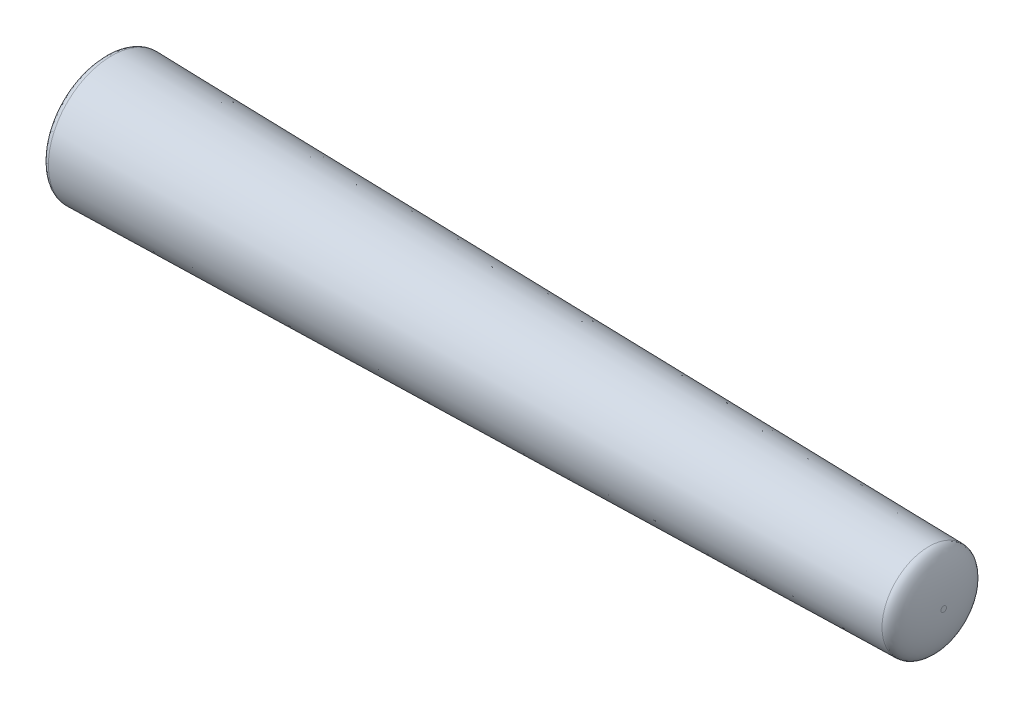
ISO-10303-21;
HEADER;
FILE_DESCRIPTION(('STEP AP214'),'2;1');
FILE_NAME('part.step','',(''),(''),'','','');
FILE_SCHEMA(('AUTOMOTIVE_DESIGN { 1 0 10303 214 1 1 1 1 }'));
ENDSEC;
DATA;
#1=APPLICATION_CONTEXT('core data for automotive mechanical design processes');
#2=APPLICATION_PROTOCOL_DEFINITION('international standard','automotive_design',2000,#1);
#3=PRODUCT_CONTEXT('',#1,'mechanical');
#4=PRODUCT('Part','Part','',(#3));
#5=PRODUCT_RELATED_PRODUCT_CATEGORY('part','',(#4));
#6=PRODUCT_DEFINITION_FORMATION('','',#4);
#7=PRODUCT_DEFINITION_CONTEXT('part definition',#1,'design');
#8=PRODUCT_DEFINITION('design','',#6,#7);
#9=PRODUCT_DEFINITION_SHAPE('','',#8);
#10=(LENGTH_UNIT() NAMED_UNIT(*) SI_UNIT(.MILLI.,.METRE.));
#11=(NAMED_UNIT(*) PLANE_ANGLE_UNIT() SI_UNIT($,.RADIAN.));
#12=(NAMED_UNIT(*) SI_UNIT($,.STERADIAN.) SOLID_ANGLE_UNIT());
#13=UNCERTAINTY_MEASURE_WITH_UNIT(LENGTH_MEASURE(1.E-05),#10,'distance_accuracy_value','');
#14=(GEOMETRIC_REPRESENTATION_CONTEXT(3) GLOBAL_UNCERTAINTY_ASSIGNED_CONTEXT((#13)) GLOBAL_UNIT_ASSIGNED_CONTEXT((#10,
#11,#12)) REPRESENTATION_CONTEXT('',''));
#15=CARTESIAN_POINT('',(0.,0.,0.));
#16=DIRECTION('',(0.,0.,1.));
#17=DIRECTION('',(1.,0.,0.));
#18=AXIS2_PLACEMENT_3D('',#15,#16,#17);
#19=CARTESIAN_POINT('',(0.,0.,0.));
#20=DIRECTION('',(-1.,0.,0.));
#21=DIRECTION('',(0.,0.,-1.));
#22=AXIS2_PLACEMENT_3D('',#19,#20,#21);
#23=CONICAL_SURFACE('',#22,3.5,0.0200712863979348);
#24=CARTESIAN_POINT('',(26.056195828594,0.,-2.97694839094373));
#25=CARTESIAN_POINT('',(26.056195828594,0.389679572021382,-2.97694839094373));
#26=CARTESIAN_POINT('',(26.056195828594,0.779211847391769,-2.89946560387902));
#27=CARTESIAN_POINT('',(26.056195828594,1.49924580904839,-2.60121777159162));
#28=CARTESIAN_POINT('',(26.056195828594,1.82947532661251,-2.38056546234488));
#29=CARTESIAN_POINT('',(26.056195828594,2.38056546234488,-1.82947532661251));
#30=CARTESIAN_POINT('',(26.056195828594,2.60121777159162,-1.49924580904838));
#31=CARTESIAN_POINT('',(26.056195828594,2.89946560387902,-0.779211847391769));
#32=CARTESIAN_POINT('',(26.056195828594,2.97694839094373,-0.389679572021377));
#33=CARTESIAN_POINT('',(26.056195828594,2.97694839094373,0.389679572021376));
#34=CARTESIAN_POINT('',(26.056195828594,2.89946560387902,0.779211847391772));
#35=CARTESIAN_POINT('',(26.056195828594,2.60121777159162,1.49924580904839));
#36=CARTESIAN_POINT('',(26.056195828594,2.38056546234487,1.82947532661251));
#37=CARTESIAN_POINT('',(26.056195828594,1.82947532661251,2.38056546234488));
#38=CARTESIAN_POINT('',(26.056195828594,1.49924580904839,2.60121777159162));
#39=CARTESIAN_POINT('',(26.056195828594,0.779211847391772,2.89946560387902));
#40=CARTESIAN_POINT('',(26.056195828594,0.389679572021377,2.97694839094373));
#41=CARTESIAN_POINT('',(26.056195828594,-0.389679572021376,2.97694839094373));
#42=CARTESIAN_POINT('',(26.056195828594,-0.779211847391766,2.89946560387902));
#43=CARTESIAN_POINT('',(26.056195828594,-1.49924580904838,2.60121777159162));
#44=CARTESIAN_POINT('',(26.056195828594,-1.82947532661251,2.38056546234488));
#45=CARTESIAN_POINT('',(26.056195828594,-2.38056546234488,1.82947532661251));
#46=CARTESIAN_POINT('',(26.056195828594,-2.60121777159162,1.49924580904839));
#47=CARTESIAN_POINT('',(26.056195828594,-2.89946560387902,0.779211847391772));
#48=CARTESIAN_POINT('',(26.056195828594,-2.97694839094373,0.389679572021372));
#49=CARTESIAN_POINT('',(26.056195828594,-2.97694839094373,-0.389679572021382));
#50=CARTESIAN_POINT('',(26.056195828594,-2.89946560387902,-0.779211847391766));
#51=CARTESIAN_POINT('',(26.056195828594,-2.60121777159162,-1.49924580904838));
#52=CARTESIAN_POINT('',(26.056195828594,-2.38056546234488,-1.8294753266125));
#53=CARTESIAN_POINT('',(26.056195828594,-1.82947532661252,-2.38056546234487));
#54=CARTESIAN_POINT('',(26.056195828594,-1.49924580904839,-2.60121777159162));
#55=CARTESIAN_POINT('',(26.056195828594,-0.779211847391773,-2.89946560387902));
#56=CARTESIAN_POINT('',(26.056195828594,-0.389679572021382,-2.97694839094373));
#57=CARTESIAN_POINT('',(26.056195828594,0.,-2.97694839094373));
#58=(BOUNDED_CURVE() B_SPLINE_CURVE(3,(#24,#25,#26,#27,#28,#29,#30,#31,#32,#33,#34,#35,#36,#37,
#38,#39,#40,#41,#42,#43,#44,#45,#46,#47,#48,#49,#50,#51,#52,#53,#54,#55,#56,#57),.UNSPECIFIED.,
.T.,.F.) B_SPLINE_CURVE_WITH_KNOTS((4,2,2,2,2,2,2,2,2,2,2,2,2,2,2,2,4),(0.,0.392699081698724,
0.785398163397448,1.17809724509617,1.5707963267949,1.96349540849362,2.35619449019234,
2.74889357189107,3.14159265358979,3.53429173528852,3.92699081698724,4.31968989868597,
4.71238898038469,5.10508806208341,5.49778714378214,5.89048622548086,6.28318530717959),
.UNSPECIFIED.) CURVE() GEOMETRIC_REPRESENTATION_ITEM() RATIONAL_B_SPLINE_CURVE((0.999999999999998,
0.999999999999998,0.999999999999998,0.999999999999998,0.999999999999998,0.999999999999998,
0.999999999999998,0.999999999999998,0.999999999999998,0.999999999999998,0.999999999999998,
0.999999999999998,0.999999999999998,0.999999999999998,0.999999999999998,0.999999999999998,
0.999999999999998,0.999999999999998,0.999999999999998,0.999999999999998,0.999999999999998,
0.999999999999998,0.999999999999998,0.999999999999998,0.999999999999998,0.999999999999998,
0.999999999999998,0.999999999999998,0.999999999999998,0.999999999999998,0.999999999999998,
0.999999999999998,0.999999999999998,0.999999999999998)) REPRESENTATION_ITEM(''));
#59=CARTESIAN_POINT('',(26.056195828594,0.,-2.97694839094373));
#60=VERTEX_POINT('',#59);
#61=EDGE_CURVE('E11',#60,#60,#58,.F.);
#62=ORIENTED_EDGE('',*,*,#61,.T.);
#63=EDGE_LOOP('',(#62));
#64=FACE_BOUND('',#63,.T.);
#65=CARTESIAN_POINT('',(-25.9257412265007,0.,-4.02043286570699));
#66=CARTESIAN_POINT('',(-25.9257412265007,-0.526272581172899,-4.02043286570699));
#67=CARTESIAN_POINT('',(-25.9257412265007,-1.05234058237466,-3.91579143418526));
#68=CARTESIAN_POINT('',(-25.9257412265007,-2.02476551490968,-3.51299983873951));
#69=CARTESIAN_POINT('',(-25.9257412265007,-2.47074443174679,-3.21500625354656));
#70=CARTESIAN_POINT('',(-25.9257412265007,-3.21500625354658,-2.47074443174677));
#71=CARTESIAN_POINT('',(-25.9257412265007,-3.51299983873951,-2.02476551490967));
#72=CARTESIAN_POINT('',(-25.9257412265007,-3.91579143418526,-1.05234058237464));
#73=CARTESIAN_POINT('',(-25.9257412265007,-4.02043286570699,-0.526272581172893));
#74=CARTESIAN_POINT('',(-25.9257412265007,-4.02043286570699,0.52627258117288));
#75=CARTESIAN_POINT('',(-25.9257412265007,-3.91579143418526,1.05234058237465));
#76=CARTESIAN_POINT('',(-25.9257412265007,-3.51299983873951,2.02476551490968));
#77=CARTESIAN_POINT('',(-25.9257412265007,-3.21500625354658,2.47074443174677));
#78=CARTESIAN_POINT('',(-25.9257412265007,-2.47074443174678,3.21500625354657));
#79=CARTESIAN_POINT('',(-25.9257412265007,-2.02476551490968,3.51299983873951));
#80=CARTESIAN_POINT('',(-25.9257412265007,-1.05234058237464,3.91579143418526));
#81=CARTESIAN_POINT('',(-25.9257412265007,-0.526272581172885,4.02043286570699));
#82=CARTESIAN_POINT('',(-25.9257412265007,0.526272581172886,4.02043286570699));
#83=CARTESIAN_POINT('',(-25.9257412265007,1.05234058237466,3.91579143418526));
#84=CARTESIAN_POINT('',(-25.9257412265007,2.02476551490968,3.51299983873951));
#85=CARTESIAN_POINT('',(-25.9257412265007,2.47074443174678,3.21500625354657));
#86=CARTESIAN_POINT('',(-25.9257412265007,3.21500625354657,2.47074443174678));
#87=CARTESIAN_POINT('',(-25.9257412265007,3.51299983873951,2.02476551490968));
#88=CARTESIAN_POINT('',(-25.9257412265007,3.91579143418526,1.05234058237465));
#89=CARTESIAN_POINT('',(-25.9257412265007,4.02043286570699,0.526272581172885));
#90=CARTESIAN_POINT('',(-25.9257412265007,4.02043286570699,-0.526272581172886));
#91=CARTESIAN_POINT('',(-25.9257412265007,3.91579143418526,-1.05234058237465));
#92=CARTESIAN_POINT('',(-25.9257412265007,3.51299983873951,-2.02476551490968));
#93=CARTESIAN_POINT('',(-25.9257412265007,3.21500625354656,-2.47074443174679));
#94=CARTESIAN_POINT('',(-25.9257412265007,2.47074443174679,-3.21500625354656));
#95=CARTESIAN_POINT('',(-25.9257412265007,2.02476551490968,-3.51299983873951));
#96=CARTESIAN_POINT('',(-25.9257412265007,1.05234058237465,-3.91579143418526));
#97=CARTESIAN_POINT('',(-25.9257412265007,0.526272581172898,-4.02043286570699));
#98=CARTESIAN_POINT('',(-25.9257412265007,0.,-4.02043286570699));
#99=(BOUNDED_CURVE() B_SPLINE_CURVE(3,(#65,#66,#67,#68,#69,#70,#71,#72,#73,#74,#75,#76,#77,#78,
#79,#80,#81,#82,#83,#84,#85,#86,#87,#88,#89,#90,#91,#92,#93,#94,#95,#96,#97,#98),.UNSPECIFIED.,
.T.,.F.) B_SPLINE_CURVE_WITH_KNOTS((4,2,2,2,2,2,2,2,2,2,2,2,2,2,2,2,4),(0.,0.392699081698725,
0.785398163397448,1.17809724509617,1.5707963267949,1.96349540849362,2.35619449019234,
2.74889357189107,3.14159265358979,3.53429173528852,3.92699081698724,4.31968989868597,
4.71238898038469,5.10508806208341,5.49778714378214,5.89048622548086,6.28318530717959),
.UNSPECIFIED.) CURVE() GEOMETRIC_REPRESENTATION_ITEM() RATIONAL_B_SPLINE_CURVE((1.,1.,1.,1.,1.,
1.,1.,1.,1.,1.,1.,1.,1.,1.,1.,1.,1.,1.,1.,1.,1.,1.,1.,1.,1.,1.,1.,1.,1.,1.,1.,1.,1.,1.)) REPRESENTATION_ITEM(''));
#100=CARTESIAN_POINT('',(-25.9257412265007,0.,-4.02043286570699));
#101=VERTEX_POINT('',#100);
#102=EDGE_CURVE('E59',#101,#101,#99,.F.);
#103=ORIENTED_EDGE('',*,*,#102,.T.);
#104=EDGE_LOOP('',(#103));
#105=FACE_BOUND('',#104,.T.);
#106=ADVANCED_FACE('F36',(#64,#105),#23,.T.);
#107=CARTESIAN_POINT('',(-27.,0.,0.));
#108=DIRECTION('',(1.,0.,0.));
#109=DIRECTION('',(0.,0.,-1.));
#110=AXIS2_PLACEMENT_3D('',#107,#108,#109);
#111=PLANE('',#110);
#112=CARTESIAN_POINT('',(-27.,0.,-0.321178125281778));
#113=CARTESIAN_POINT('',(-27.,0.0420420503598163,-0.321178125281778));
#114=CARTESIAN_POINT('',(-27.,0.0840677575511737,-0.31281869237354));
#115=CARTESIAN_POINT('',(-27.,0.161751337215658,-0.280641100102821));
#116=CARTESIAN_POINT('',(-27.,0.197379011451117,-0.256835449259939));
#117=CARTESIAN_POINT('',(-27.,0.256835449259939,-0.197379011451117));
#118=CARTESIAN_POINT('',(-27.,0.280641100102821,-0.161751337215658));
#119=CARTESIAN_POINT('',(-27.,0.31281869237354,-0.084067757551173));
#120=CARTESIAN_POINT('',(-27.,0.321178125281778,-0.0420420503598153));
#121=CARTESIAN_POINT('',(-27.,0.321178125281778,0.0420420503598153));
#122=CARTESIAN_POINT('',(-27.,0.312818692373541,0.0840677575511741));
#123=CARTESIAN_POINT('',(-27.,0.28064110010282,0.161751337215657));
#124=CARTESIAN_POINT('',(-27.,0.25683544925994,0.197379011451117));
#125=CARTESIAN_POINT('',(-27.,0.197379011451115,0.256835449259939));
#126=CARTESIAN_POINT('',(-27.,0.161751337215658,0.28064110010282));
#127=CARTESIAN_POINT('',(-27.,0.0840677575511744,0.312818692373541));
#128=CARTESIAN_POINT('',(-27.,0.0420420503598153,0.321178125281778));
#129=CARTESIAN_POINT('',(-27.,-0.0420420503598153,0.321178125281778));
#130=CARTESIAN_POINT('',(-27.,-0.0840677575511727,0.312818692373541));
#131=CARTESIAN_POINT('',(-27.,-0.161751337215658,0.28064110010282));
#132=CARTESIAN_POINT('',(-27.,-0.197379011451116,0.25683544925994));
#133=CARTESIAN_POINT('',(-27.,-0.256835449259939,0.197379011451115));
#134=CARTESIAN_POINT('',(-27.,-0.28064110010282,0.161751337215658));
#135=CARTESIAN_POINT('',(-27.,-0.312818692373541,0.0840677575511741));
#136=CARTESIAN_POINT('',(-27.,-0.321178125281778,0.0420420503598148));
#137=CARTESIAN_POINT('',(-27.,-0.321178125281778,-0.0420420503598158));
#138=CARTESIAN_POINT('',(-27.,-0.312818692373541,-0.0840677575511729));
#139=CARTESIAN_POINT('',(-27.,-0.28064110010282,-0.161751337215657));
#140=CARTESIAN_POINT('',(-27.,-0.25683544925994,-0.197379011451116));
#141=CARTESIAN_POINT('',(-27.,-0.197379011451117,-0.256835449259939));
#142=CARTESIAN_POINT('',(-27.,-0.161751337215658,-0.28064110010282));
#143=CARTESIAN_POINT('',(-27.,-0.0840677575511738,-0.312818692373541));
#144=CARTESIAN_POINT('',(-27.,-0.0420420503598164,-0.321178125281778));
#145=CARTESIAN_POINT('',(-27.,0.,-0.321178125281778));
#146=(BOUNDED_CURVE() B_SPLINE_CURVE(3,(#112,#113,#114,#115,#116,#117,#118,#119,#120,#121,#122,
#123,#124,#125,#126,#127,#128,#129,#130,#131,#132,#133,#134,#135,#136,#137,#138,#139,#140,#141,
#142,#143,#144,#145),.UNSPECIFIED.,.T.,.F.) B_SPLINE_CURVE_WITH_KNOTS((4,2,2,2,2,2,2,2,2,2,2,2,
2,2,2,2,4),(0.,0.392699081698724,0.785398163397448,1.17809724509617,1.5707963267949,
1.96349540849362,2.35619449019234,2.74889357189107,3.14159265358979,3.53429173528852,
3.92699081698724,4.31968989868597,4.71238898038469,5.10508806208341,5.49778714378214,
5.89048622548086,6.28318530717959),
.UNSPECIFIED.) CURVE() GEOMETRIC_REPRESENTATION_ITEM() RATIONAL_B_SPLINE_CURVE((1.,1.,1.,1.,1.,
1.,1.,1.,1.,1.,1.,1.,1.,1.,1.,1.,1.,1.,1.,1.,1.,1.,1.,1.,1.,1.,1.,1.,1.,1.,1.,1.,1.,1.)) REPRESENTATION_ITEM(''));
#147=CARTESIAN_POINT('',(-27.,0.,-0.321178125281778));
#148=VERTEX_POINT('',#147);
#149=EDGE_CURVE('E54',#148,#148,#146,.F.);
#150=ORIENTED_EDGE('',*,*,#149,.T.);
#151=EDGE_LOOP('',(#150));
#152=FACE_BOUND('',#151,.T.);
#153=ADVANCED_FACE('F82',(#152),#111,.F.);
#154=CARTESIAN_POINT('',(27.,0.,0.));
#155=DIRECTION('',(1.,0.,0.));
#156=DIRECTION('',(0.,0.,-1.));
#157=AXIS2_PLACEMENT_3D('',#154,#155,#156);
#158=PLANE('',#157);
#159=CARTESIAN_POINT('',(27.,0.,-0.177512371162491));
#160=CARTESIAN_POINT('',(27.,-0.0232361921468083,-0.177512371162491));
#161=CARTESIAN_POINT('',(27.,-0.0464636011457927,-0.172892152250407));
#162=CARTESIAN_POINT('',(27.,-0.0893984858216635,-0.155107940718737));
#163=CARTESIAN_POINT('',(27.,-0.10908973235754,-0.141950670429462));
#164=CARTESIAN_POINT('',(27.,-0.141950670429463,-0.109089732357539));
#165=CARTESIAN_POINT('',(27.,-0.155107940718737,-0.089398485821663));
#166=CARTESIAN_POINT('',(27.,-0.172892152250408,-0.0464636011457922));
#167=CARTESIAN_POINT('',(27.,-0.177512371162491,-0.0232361921468083));
#168=CARTESIAN_POINT('',(27.,-0.177512371162491,0.0232361921468077));
#169=CARTESIAN_POINT('',(27.,-0.172892152250407,0.0464636011457927));
#170=CARTESIAN_POINT('',(27.,-0.155107940718737,0.0893984858216635));
#171=CARTESIAN_POINT('',(27.,-0.141950670429462,0.109089732357539));
#172=CARTESIAN_POINT('',(27.,-0.109089732357539,0.141950670429462));
#173=CARTESIAN_POINT('',(27.,-0.089398485821663,0.155107940718737));
#174=CARTESIAN_POINT('',(27.,-0.0464636011457923,0.172892152250408));
#175=CARTESIAN_POINT('',(27.,-0.0232361921468079,0.177512371162491));
#176=CARTESIAN_POINT('',(27.,0.023236192146808,0.177512371162491));
#177=CARTESIAN_POINT('',(27.,0.0464636011457929,0.172892152250408));
#178=CARTESIAN_POINT('',(27.,0.0893984858216633,0.155107940718737));
#179=CARTESIAN_POINT('',(27.,0.109089732357539,0.141950670429462));
#180=CARTESIAN_POINT('',(27.,0.141950670429462,0.10908973235754));
#181=CARTESIAN_POINT('',(27.,0.155107940718737,0.0893984858216633));
#182=CARTESIAN_POINT('',(27.,0.172892152250408,0.0464636011457926));
#183=CARTESIAN_POINT('',(27.,0.177512371162491,0.0232361921468079));
#184=CARTESIAN_POINT('',(27.,0.177512371162491,-0.023236192146808));
#185=CARTESIAN_POINT('',(27.,0.172892152250408,-0.0464636011457924));
#186=CARTESIAN_POINT('',(27.,0.155107940718737,-0.0893984858216632));
#187=CARTESIAN_POINT('',(27.,0.141950670429462,-0.109089732357539));
#188=CARTESIAN_POINT('',(27.,0.109089732357539,-0.141950670429462));
#189=CARTESIAN_POINT('',(27.,0.0893984858216631,-0.155107940718737));
#190=CARTESIAN_POINT('',(27.,0.0464636011457926,-0.172892152250408));
#191=CARTESIAN_POINT('',(27.,0.0232361921468083,-0.177512371162491));
#192=CARTESIAN_POINT('',(27.,0.,-0.177512371162491));
#193=(BOUNDED_CURVE() B_SPLINE_CURVE(3,(#159,#160,#161,#162,#163,#164,#165,#166,#167,#168,#169,
#170,#171,#172,#173,#174,#175,#176,#177,#178,#179,#180,#181,#182,#183,#184,#185,#186,#187,#188,
#189,#190,#191,#192),.UNSPECIFIED.,.T.,.F.) B_SPLINE_CURVE_WITH_KNOTS((4,2,2,2,2,2,2,2,2,2,2,2,
2,2,2,2,4),(0.,0.392699081698725,0.785398163397448,1.17809724509617,1.5707963267949,
1.96349540849362,2.35619449019234,2.74889357189107,3.14159265358979,3.53429173528852,
3.92699081698724,4.31968989868597,4.71238898038469,5.10508806208341,5.49778714378214,
5.89048622548086,6.28318530717959),
.UNSPECIFIED.) CURVE() GEOMETRIC_REPRESENTATION_ITEM() RATIONAL_B_SPLINE_CURVE((1.,1.,1.,1.,1.,
1.,1.,1.,1.,1.,1.,1.,1.,1.,1.,1.,1.,1.,1.,1.,1.,1.,1.,1.,1.,1.,1.,1.,1.,1.,1.,1.,1.,1.)) REPRESENTATION_ITEM(''));
#194=CARTESIAN_POINT('',(27.,0.,-0.177512371162491));
#195=VERTEX_POINT('',#194);
#196=EDGE_CURVE('E49',#195,#195,#193,.F.);
#197=ORIENTED_EDGE('',*,*,#196,.T.);
#198=EDGE_LOOP('',(#197));
#199=FACE_BOUND('',#198,.T.);
#200=ADVANCED_FACE('F115',(#199),#158,.T.);
#201=CARTESIAN_POINT('',(-25.9257412265007,0.,-4.02043286570699));
#202=CARTESIAN_POINT('',(-25.9257412265007,0.526272581172898,-4.02043286570699));
#203=CARTESIAN_POINT('',(-25.9257412265007,1.05234058237465,-3.91579143418526));
#204=CARTESIAN_POINT('',(-25.9257412265007,2.02476551490968,-3.51299983873951));
#205=CARTESIAN_POINT('',(-25.9257412265007,2.47074443174679,-3.21500625354656));
#206=CARTESIAN_POINT('',(-25.9257412265007,3.21500625354656,-2.47074443174679));
#207=CARTESIAN_POINT('',(-25.9257412265007,3.51299983873951,-2.02476551490968));
#208=CARTESIAN_POINT('',(-25.9257412265007,3.91579143418526,-1.05234058237465));
#209=CARTESIAN_POINT('',(-25.9257412265007,4.02043286570699,-0.526272581172886));
#210=CARTESIAN_POINT('',(-25.9257412265007,4.02043286570699,0.526272581172885));
#211=CARTESIAN_POINT('',(-25.9257412265007,3.91579143418526,1.05234058237465));
#212=CARTESIAN_POINT('',(-25.9257412265007,3.51299983873951,2.02476551490968));
#213=CARTESIAN_POINT('',(-25.9257412265007,3.21500625354657,2.47074443174678));
#214=CARTESIAN_POINT('',(-25.9257412265007,2.47074443174678,3.21500625354657));
#215=CARTESIAN_POINT('',(-25.9257412265007,2.02476551490968,3.51299983873951));
#216=CARTESIAN_POINT('',(-25.9257412265007,1.05234058237466,3.91579143418526));
#217=CARTESIAN_POINT('',(-25.9257412265007,0.526272581172886,4.02043286570699));
#218=CARTESIAN_POINT('',(-25.9257412265007,-0.526272581172885,4.02043286570699));
#219=CARTESIAN_POINT('',(-25.9257412265007,-1.05234058237464,3.91579143418526));
#220=CARTESIAN_POINT('',(-25.9257412265007,-2.02476551490968,3.51299983873951));
#221=CARTESIAN_POINT('',(-25.9257412265007,-2.47074443174678,3.21500625354657));
#222=CARTESIAN_POINT('',(-25.9257412265007,-3.21500625354658,2.47074443174677));
#223=CARTESIAN_POINT('',(-25.9257412265007,-3.51299983873951,2.02476551490968));
#224=CARTESIAN_POINT('',(-25.9257412265007,-3.91579143418526,1.05234058237465));
#225=CARTESIAN_POINT('',(-25.9257412265007,-4.02043286570699,0.52627258117288));
#226=CARTESIAN_POINT('',(-25.9257412265007,-4.02043286570699,-0.526272581172893));
#227=CARTESIAN_POINT('',(-25.9257412265007,-3.91579143418526,-1.05234058237464));
#228=CARTESIAN_POINT('',(-25.9257412265007,-3.51299983873951,-2.02476551490967));
#229=CARTESIAN_POINT('',(-25.9257412265007,-3.21500625354658,-2.47074443174677));
#230=CARTESIAN_POINT('',(-25.9257412265007,-2.47074443174679,-3.21500625354656));
#231=CARTESIAN_POINT('',(-25.9257412265007,-2.02476551490968,-3.51299983873951));
#232=CARTESIAN_POINT('',(-25.9257412265007,-1.05234058237466,-3.91579143418526));
#233=CARTESIAN_POINT('',(-25.9257412265007,-0.526272581172899,-4.02043286570699));
#234=CARTESIAN_POINT('',(-25.9257412265007,0.,-4.02043286570699));
#235=CARTESIAN_POINT('',(-27.,0.,-4.04199751711343));
#236=CARTESIAN_POINT('',(-27.,0.529095382880288,-4.04199751711345));
#237=CARTESIAN_POINT('',(-27.,1.05798508847083,-3.93679481369169));
#238=CARTESIAN_POINT('',(-27.,2.03562587844944,-3.53184273935339));
#239=CARTESIAN_POINT('',(-27.,2.48399692076097,-3.23225078701922));
#240=CARTESIAN_POINT('',(-27.,3.23225078701922,-2.48399692076097));
#241=CARTESIAN_POINT('',(-27.,3.53184273935337,-2.03562587844944));
#242=CARTESIAN_POINT('',(-27.,3.9367948136917,-1.05798508847083));
#243=CARTESIAN_POINT('',(-27.,4.04199751711343,-0.529095382880275));
#244=CARTESIAN_POINT('',(-27.,4.04199751711343,0.529095382880274));
#245=CARTESIAN_POINT('',(-27.,3.93679481369168,1.05798508847083));
#246=CARTESIAN_POINT('',(-27.,3.53184273935339,2.03562587844944));
#247=CARTESIAN_POINT('',(-27.,3.23225078701924,2.48399692076098));
#248=CARTESIAN_POINT('',(-27.,2.48399692076094,3.23225078701921));
#249=CARTESIAN_POINT('',(-27.,2.03562587844944,3.53184273935338));
#250=CARTESIAN_POINT('',(-27.,1.05798508847085,3.93679481369169));
#251=CARTESIAN_POINT('',(-27.,0.529095382880275,4.04199751711343));
#252=CARTESIAN_POINT('',(-27.,-0.529095382880274,4.04199751711343));
#253=CARTESIAN_POINT('',(-27.,-1.05798508847082,3.9367948136917));
#254=CARTESIAN_POINT('',(-27.,-2.03562587844944,3.53184273935337));
#255=CARTESIAN_POINT('',(-27.,-2.48399692076097,3.23225078701925));
#256=CARTESIAN_POINT('',(-27.,-3.23225078701922,2.48399692076094));
#257=CARTESIAN_POINT('',(-27.,-3.53184273935339,2.03562587844945));
#258=CARTESIAN_POINT('',(-27.,-3.93679481369168,1.05798508847083));
#259=CARTESIAN_POINT('',(-27.,-4.04199751711343,0.529095382880269));
#260=CARTESIAN_POINT('',(-27.,-4.04199751711343,-0.529095382880282));
#261=CARTESIAN_POINT('',(-27.,-3.93679481369167,-1.05798508847082));
#262=CARTESIAN_POINT('',(-27.,-3.53184273935341,-2.03562587844945));
#263=CARTESIAN_POINT('',(-27.,-3.23225078701924,-2.48399692076096));
#264=CARTESIAN_POINT('',(-27.,-2.48399692076097,-3.23225078701921));
#265=CARTESIAN_POINT('',(-27.,-2.03562587844945,-3.53184273935339));
#266=CARTESIAN_POINT('',(-27.,-1.05798508847083,-3.93679481369168));
#267=CARTESIAN_POINT('',(-27.,-0.529095382880288,-4.04199751711341));
#268=CARTESIAN_POINT('',(-27.,0.,-4.04199751711343));
#269=CARTESIAN_POINT('',(-27.,0.,-0.321178125281778));
#270=CARTESIAN_POINT('',(-27.,0.0420420503598163,-0.321178125281778));
#271=CARTESIAN_POINT('',(-27.,0.0840677575511737,-0.31281869237354));
#272=CARTESIAN_POINT('',(-27.,0.161751337215658,-0.280641100102821));
#273=CARTESIAN_POINT('',(-27.,0.197379011451117,-0.256835449259939));
#274=CARTESIAN_POINT('',(-27.,0.256835449259939,-0.197379011451117));
#275=CARTESIAN_POINT('',(-27.,0.280641100102821,-0.161751337215658));
#276=CARTESIAN_POINT('',(-27.,0.31281869237354,-0.084067757551173));
#277=CARTESIAN_POINT('',(-27.,0.321178125281778,-0.0420420503598153));
#278=CARTESIAN_POINT('',(-27.,0.321178125281778,0.0420420503598153));
#279=CARTESIAN_POINT('',(-27.,0.312818692373541,0.0840677575511741));
#280=CARTESIAN_POINT('',(-27.,0.28064110010282,0.161751337215657));
#281=CARTESIAN_POINT('',(-27.,0.25683544925994,0.197379011451117));
#282=CARTESIAN_POINT('',(-27.,0.197379011451115,0.256835449259939));
#283=CARTESIAN_POINT('',(-27.,0.161751337215658,0.28064110010282));
#284=CARTESIAN_POINT('',(-27.,0.0840677575511744,0.312818692373541));
#285=CARTESIAN_POINT('',(-27.,0.0420420503598153,0.321178125281778));
#286=CARTESIAN_POINT('',(-27.,-0.0420420503598153,0.321178125281778));
#287=CARTESIAN_POINT('',(-27.,-0.0840677575511727,0.312818692373541));
#288=CARTESIAN_POINT('',(-27.,-0.161751337215658,0.28064110010282));
#289=CARTESIAN_POINT('',(-27.,-0.197379011451116,0.25683544925994));
#290=CARTESIAN_POINT('',(-27.,-0.256835449259939,0.197379011451115));
#291=CARTESIAN_POINT('',(-27.,-0.28064110010282,0.161751337215658));
#292=CARTESIAN_POINT('',(-27.,-0.312818692373541,0.0840677575511741));
#293=CARTESIAN_POINT('',(-27.,-0.321178125281778,0.0420420503598148));
#294=CARTESIAN_POINT('',(-27.,-0.321178125281778,-0.0420420503598158));
#295=CARTESIAN_POINT('',(-27.,-0.312818692373541,-0.0840677575511729));
#296=CARTESIAN_POINT('',(-27.,-0.28064110010282,-0.161751337215657));
#297=CARTESIAN_POINT('',(-27.,-0.25683544925994,-0.197379011451116));
#298=CARTESIAN_POINT('',(-27.,-0.197379011451117,-0.256835449259939));
#299=CARTESIAN_POINT('',(-27.,-0.161751337215658,-0.28064110010282));
#300=CARTESIAN_POINT('',(-27.,-0.0840677575511738,-0.312818692373541));
#301=CARTESIAN_POINT('',(-27.,-0.0420420503598164,-0.321178125281778));
#302=CARTESIAN_POINT('',(-27.,0.,-0.321178125281778));
#303=(BOUNDED_SURFACE() B_SPLINE_SURFACE(2,3,((#201,#202,#203,#204,#205,#206,#207,#208,#209,
#210,#211,#212,#213,#214,#215,#216,#217,#218,#219,#220,#221,#222,#223,#224,#225,#226,#227,#228,
#229,#230,#231,#232,#233,#234),(#235,#236,#237,#238,#239,#240,#241,#242,#243,#244,#245,#246,
#247,#248,#249,#250,#251,#252,#253,#254,#255,#256,#257,#258,#259,#260,#261,#262,#263,#264,#265,
#266,#267,#268),(#269,#270,#271,#272,#273,#274,#275,#276,#277,#278,#279,#280,#281,#282,#283,
#284,#285,#286,#287,#288,#289,#290,#291,#292,#293,#294,#295,#296,#297,#298,#299,#300,#301,
#302)),.UNSPECIFIED.,.F.,.T.,.F.) B_SPLINE_SURFACE_WITH_KNOTS((3,3),(4,2,2,2,2,2,2,2,2,2,2,2,2,
2,2,2,4),(0.,1.),(0.,0.392699081698724,0.785398163397448,1.17809724509617,1.5707963267949,
1.96349540849362,2.35619449019234,2.74889357189107,3.14159265358979,3.53429173528852,
3.92699081698724,4.31968989868597,4.71238898038469,5.10508806208341,5.49778714378214,
5.89048622548086,6.28318530717959),
.UNSPECIFIED.) GEOMETRIC_REPRESENTATION_ITEM() RATIONAL_B_SPLINE_SURFACE(((1.,1.,1.,1.,1.,1.,1.,
1.,1.,1.,1.,1.,1.,1.,1.,1.,1.,1.,1.,1.,1.,1.,1.,1.,1.,1.,1.,1.,1.,1.,1.,1.,1.,1.),
(0.69997502141734,0.69997502141734,0.69997502141734,0.69997502141734,0.69997502141734,
0.69997502141734,0.69997502141734,0.69997502141734,0.69997502141734,0.69997502141734,
0.69997502141734,0.69997502141734,0.69997502141734,0.69997502141734,0.69997502141734,
0.69997502141734,0.69997502141734,0.69997502141734,0.69997502141734,0.69997502141734,
0.69997502141734,0.69997502141734,0.69997502141734,0.69997502141734,0.69997502141734,
0.69997502141734,0.69997502141734,0.69997502141734,0.69997502141734,0.69997502141734,
0.69997502141734,0.69997502141734,0.69997502141734,0.69997502141734),(1.,1.,1.,1.,1.,1.,1.,1.,
1.,1.,1.,1.,1.,1.,1.,1.,1.,1.,1.,1.,1.,1.,1.,1.,1.,1.,1.,1.,1.,1.,1.,1.,1.,1.))) REPRESENTATION_ITEM('') SURFACE());
#304=ORIENTED_EDGE('',*,*,#149,.F.);
#305=EDGE_LOOP('',(#304));
#306=FACE_BOUND('',#305,.T.);
#307=ORIENTED_EDGE('',*,*,#102,.F.);
#308=EDGE_LOOP('',(#307));
#309=FACE_BOUND('',#308,.T.);
#310=ADVANCED_FACE('F86',(#306,#309),#303,.T.);
#311=CARTESIAN_POINT('',(27.,0.,-0.177512371162491));
#312=CARTESIAN_POINT('',(27.,0.0232361921468083,-0.177512371162491));
#313=CARTESIAN_POINT('',(27.,0.0464636011457926,-0.172892152250408));
#314=CARTESIAN_POINT('',(27.,0.0893984858216631,-0.155107940718737));
#315=CARTESIAN_POINT('',(27.,0.109089732357539,-0.141950670429462));
#316=CARTESIAN_POINT('',(27.,0.141950670429462,-0.109089732357539));
#317=CARTESIAN_POINT('',(27.,0.155107940718737,-0.0893984858216632));
#318=CARTESIAN_POINT('',(27.,0.172892152250408,-0.0464636011457924));
#319=CARTESIAN_POINT('',(27.,0.177512371162491,-0.023236192146808));
#320=CARTESIAN_POINT('',(27.,0.177512371162491,0.0232361921468079));
#321=CARTESIAN_POINT('',(27.,0.172892152250408,0.0464636011457926));
#322=CARTESIAN_POINT('',(27.,0.155107940718737,0.0893984858216633));
#323=CARTESIAN_POINT('',(27.,0.141950670429462,0.10908973235754));
#324=CARTESIAN_POINT('',(27.,0.109089732357539,0.141950670429462));
#325=CARTESIAN_POINT('',(27.,0.0893984858216633,0.155107940718737));
#326=CARTESIAN_POINT('',(27.,0.0464636011457929,0.172892152250408));
#327=CARTESIAN_POINT('',(27.,0.023236192146808,0.177512371162491));
#328=CARTESIAN_POINT('',(27.,-0.0232361921468079,0.177512371162491));
#329=CARTESIAN_POINT('',(27.,-0.0464636011457923,0.172892152250408));
#330=CARTESIAN_POINT('',(27.,-0.089398485821663,0.155107940718737));
#331=CARTESIAN_POINT('',(27.,-0.109089732357539,0.141950670429462));
#332=CARTESIAN_POINT('',(27.,-0.141950670429462,0.109089732357539));
#333=CARTESIAN_POINT('',(27.,-0.155107940718737,0.0893984858216635));
#334=CARTESIAN_POINT('',(27.,-0.172892152250407,0.0464636011457927));
#335=CARTESIAN_POINT('',(27.,-0.177512371162491,0.0232361921468077));
#336=CARTESIAN_POINT('',(27.,-0.177512371162491,-0.0232361921468083));
#337=CARTESIAN_POINT('',(27.,-0.172892152250408,-0.0464636011457922));
#338=CARTESIAN_POINT('',(27.,-0.155107940718737,-0.089398485821663));
#339=CARTESIAN_POINT('',(27.,-0.141950670429463,-0.109089732357539));
#340=CARTESIAN_POINT('',(27.,-0.10908973235754,-0.141950670429462));
#341=CARTESIAN_POINT('',(27.,-0.0893984858216635,-0.155107940718737));
#342=CARTESIAN_POINT('',(27.,-0.0464636011457927,-0.172892152250407));
#343=CARTESIAN_POINT('',(27.,-0.0232361921468083,-0.177512371162491));
#344=CARTESIAN_POINT('',(27.,0.,-0.177512371162491));
#345=CARTESIAN_POINT('',(27.,0.,-2.95800248288657));
#346=CARTESIAN_POINT('',(27.,0.387199571573363,-2.95800248288656));
#347=CARTESIAN_POINT('',(27.,0.774252783921725,-2.88101281211645));
#348=CARTESIAN_POINT('',(27.,1.48970430226926,-2.58466308999649));
#349=CARTESIAN_POINT('',(27.,1.8178321716837,-2.36541505714779));
#350=CARTESIAN_POINT('',(27.,2.36541505714778,-1.81783217168369));
#351=CARTESIAN_POINT('',(27.,2.58466308999649,-1.48970430226925));
#352=CARTESIAN_POINT('',(27.,2.88101281211646,-0.774252783921724));
#353=CARTESIAN_POINT('',(27.,2.95800248288657,-0.387199571573357));
#354=CARTESIAN_POINT('',(27.,2.95800248288657,0.387199571573357));
#355=CARTESIAN_POINT('',(27.,2.88101281211646,0.774252783921729));
#356=CARTESIAN_POINT('',(27.,2.58466308999649,1.48970430226925));
#357=CARTESIAN_POINT('',(27.,2.36541505714778,1.8178321716837));
#358=CARTESIAN_POINT('',(27.,1.8178321716837,2.36541505714778));
#359=CARTESIAN_POINT('',(27.,1.48970430226925,2.58466308999647));
#360=CARTESIAN_POINT('',(27.,0.774252783921737,2.88101281211647));
#361=CARTESIAN_POINT('',(27.,0.387199571573358,2.95800248288657));
#362=CARTESIAN_POINT('',(27.,-0.387199571573357,2.95800248288657));
#363=CARTESIAN_POINT('',(27.,-0.774252783921719,2.88101281211645));
#364=CARTESIAN_POINT('',(27.,-1.48970430226925,2.5846630899965));
#365=CARTESIAN_POINT('',(27.,-1.8178321716837,2.36541505714778));
#366=CARTESIAN_POINT('',(27.,-2.36541505714778,1.81783217168369));
#367=CARTESIAN_POINT('',(27.,-2.58466308999648,1.48970430226926));
#368=CARTESIAN_POINT('',(27.,-2.88101281211646,0.774252783921732));
#369=CARTESIAN_POINT('',(27.,-2.95800248288657,0.387199571573353));
#370=CARTESIAN_POINT('',(27.,-2.95800248288656,-0.387199571573362));
#371=CARTESIAN_POINT('',(27.,-2.88101281211646,-0.774252783921723));
#372=CARTESIAN_POINT('',(27.,-2.58466308999649,-1.48970430226925));
#373=CARTESIAN_POINT('',(27.,-2.36541505714778,-1.81783217168368));
#374=CARTESIAN_POINT('',(27.,-1.81783217168371,-2.36541505714778));
#375=CARTESIAN_POINT('',(27.,-1.48970430226925,-2.58466308999647));
#376=CARTESIAN_POINT('',(27.,-0.774252783921734,-2.88101281211647));
#377=CARTESIAN_POINT('',(27.,-0.387199571573363,-2.95800248288658));
#378=CARTESIAN_POINT('',(27.,0.,-2.95800248288657));
#379=CARTESIAN_POINT('',(26.056195828594,0.,-2.97694839094373));
#380=CARTESIAN_POINT('',(26.056195828594,0.389679572021382,-2.97694839094373));
#381=CARTESIAN_POINT('',(26.056195828594,0.779211847391769,-2.89946560387902));
#382=CARTESIAN_POINT('',(26.056195828594,1.49924580904839,-2.60121777159162));
#383=CARTESIAN_POINT('',(26.056195828594,1.82947532661251,-2.38056546234488));
#384=CARTESIAN_POINT('',(26.056195828594,2.38056546234488,-1.82947532661251));
#385=CARTESIAN_POINT('',(26.056195828594,2.60121777159162,-1.49924580904838));
#386=CARTESIAN_POINT('',(26.056195828594,2.89946560387902,-0.779211847391768));
#387=CARTESIAN_POINT('',(26.056195828594,2.97694839094373,-0.389679572021377));
#388=CARTESIAN_POINT('',(26.056195828594,2.97694839094373,0.389679572021376));
#389=CARTESIAN_POINT('',(26.056195828594,2.89946560387902,0.779211847391772));
#390=CARTESIAN_POINT('',(26.056195828594,2.60121777159162,1.49924580904839));
#391=CARTESIAN_POINT('',(26.056195828594,2.38056546234487,1.82947532661251));
#392=CARTESIAN_POINT('',(26.056195828594,1.82947532661251,2.38056546234488));
#393=CARTESIAN_POINT('',(26.056195828594,1.49924580904839,2.60121777159162));
#394=CARTESIAN_POINT('',(26.056195828594,0.779211847391772,2.89946560387902));
#395=CARTESIAN_POINT('',(26.056195828594,0.389679572021377,2.97694839094373));
#396=CARTESIAN_POINT('',(26.056195828594,-0.389679572021376,2.97694839094373));
#397=CARTESIAN_POINT('',(26.056195828594,-0.779211847391766,2.89946560387902));
#398=CARTESIAN_POINT('',(26.056195828594,-1.49924580904838,2.60121777159162));
#399=CARTESIAN_POINT('',(26.056195828594,-1.82947532661251,2.38056546234488));
#400=CARTESIAN_POINT('',(26.056195828594,-2.38056546234488,1.82947532661251));
#401=CARTESIAN_POINT('',(26.056195828594,-2.60121777159162,1.49924580904839));
#402=CARTESIAN_POINT('',(26.056195828594,-2.89946560387902,0.779211847391772));
#403=CARTESIAN_POINT('',(26.056195828594,-2.97694839094373,0.389679572021372));
#404=CARTESIAN_POINT('',(26.056195828594,-2.97694839094373,-0.389679572021382));
#405=CARTESIAN_POINT('',(26.056195828594,-2.89946560387902,-0.779211847391766));
#406=CARTESIAN_POINT('',(26.056195828594,-2.60121777159162,-1.49924580904838));
#407=CARTESIAN_POINT('',(26.056195828594,-2.38056546234488,-1.8294753266125));
#408=CARTESIAN_POINT('',(26.056195828594,-1.82947532661252,-2.38056546234487));
#409=CARTESIAN_POINT('',(26.056195828594,-1.49924580904839,-2.60121777159162));
#410=CARTESIAN_POINT('',(26.056195828594,-0.779211847391773,-2.89946560387902));
#411=CARTESIAN_POINT('',(26.056195828594,-0.389679572021382,-2.97694839094373));
#412=CARTESIAN_POINT('',(26.056195828594,0.,-2.97694839094373));
#413=(BOUNDED_SURFACE() B_SPLINE_SURFACE(2,3,((#311,#312,#313,#314,#315,#316,#317,#318,#319,
#320,#321,#322,#323,#324,#325,#326,#327,#328,#329,#330,#331,#332,#333,#334,#335,#336,#337,#338,
#339,#340,#341,#342,#343,#344),(#345,#346,#347,#348,#349,#350,#351,#352,#353,#354,#355,#356,
#357,#358,#359,#360,#361,#362,#363,#364,#365,#366,#367,#368,#369,#370,#371,#372,#373,#374,#375,
#376,#377,#378),(#379,#380,#381,#382,#383,#384,#385,#386,#387,#388,#389,#390,#391,#392,#393,
#394,#395,#396,#397,#398,#399,#400,#401,#402,#403,#404,#405,#406,#407,#408,#409,#410,#411,
#412)),.UNSPECIFIED.,.F.,.T.,.F.) B_SPLINE_SURFACE_WITH_KNOTS((3,3),(4,2,2,2,2,2,2,2,2,2,2,2,2,
2,2,2,4),(0.,1.),(0.,0.392699081698724,0.785398163397448,1.17809724509617,1.5707963267949,
1.96349540849362,2.35619449019234,2.74889357189107,3.14159265358979,3.53429173528852,
3.92699081698724,4.31968989868597,4.71238898038469,5.10508806208341,5.49778714378214,
5.89048622548086,6.28318530717959),
.UNSPECIFIED.) GEOMETRIC_REPRESENTATION_ITEM() RATIONAL_B_SPLINE_SURFACE(((1.,1.,1.,1.,1.,1.,1.,
1.,1.,1.,1.,1.,1.,1.,1.,1.,1.,1.,1.,1.,1.,1.,1.,1.,1.,1.,1.,1.,1.,1.,1.,1.,1.,1.),
(0.714167325906047,0.714167325906047,0.714167325906047,0.714167325906047,0.714167325906047,
0.714167325906047,0.714167325906047,0.714167325906047,0.714167325906047,0.714167325906047,
0.714167325906047,0.714167325906047,0.714167325906047,0.714167325906047,0.714167325906047,
0.714167325906047,0.714167325906047,0.714167325906047,0.714167325906047,0.714167325906047,
0.714167325906047,0.714167325906047,0.714167325906047,0.714167325906047,0.714167325906047,
0.714167325906047,0.714167325906047,0.714167325906047,0.714167325906047,0.714167325906047,
0.714167325906047,0.714167325906047,0.714167325906047,0.714167325906047),(1.,1.,1.,1.,1.,1.,1.,
1.,1.,1.,1.,1.,1.,1.,1.,1.,1.,1.,1.,1.,1.,1.,1.,1.,1.,1.,1.,1.,1.,1.,1.,1.,1.,1.))) REPRESENTATION_ITEM('') SURFACE());
#414=ORIENTED_EDGE('',*,*,#61,.F.);
#415=EDGE_LOOP('',(#414));
#416=FACE_BOUND('',#415,.T.);
#417=ORIENTED_EDGE('',*,*,#196,.F.);
#418=EDGE_LOOP('',(#417));
#419=FACE_BOUND('',#418,.T.);
#420=ADVANCED_FACE('F39',(#416,#419),#413,.T.);
#421=CLOSED_SHELL('',(#106,#153,#200,#310,#420));
#422=MANIFOLD_SOLID_BREP('B2',#421);
#423=ADVANCED_BREP_SHAPE_REPRESENTATION('',(#18,#422),#14);
#424=SHAPE_DEFINITION_REPRESENTATION(#9,#423);
ENDSEC;
END-ISO-10303-21;
